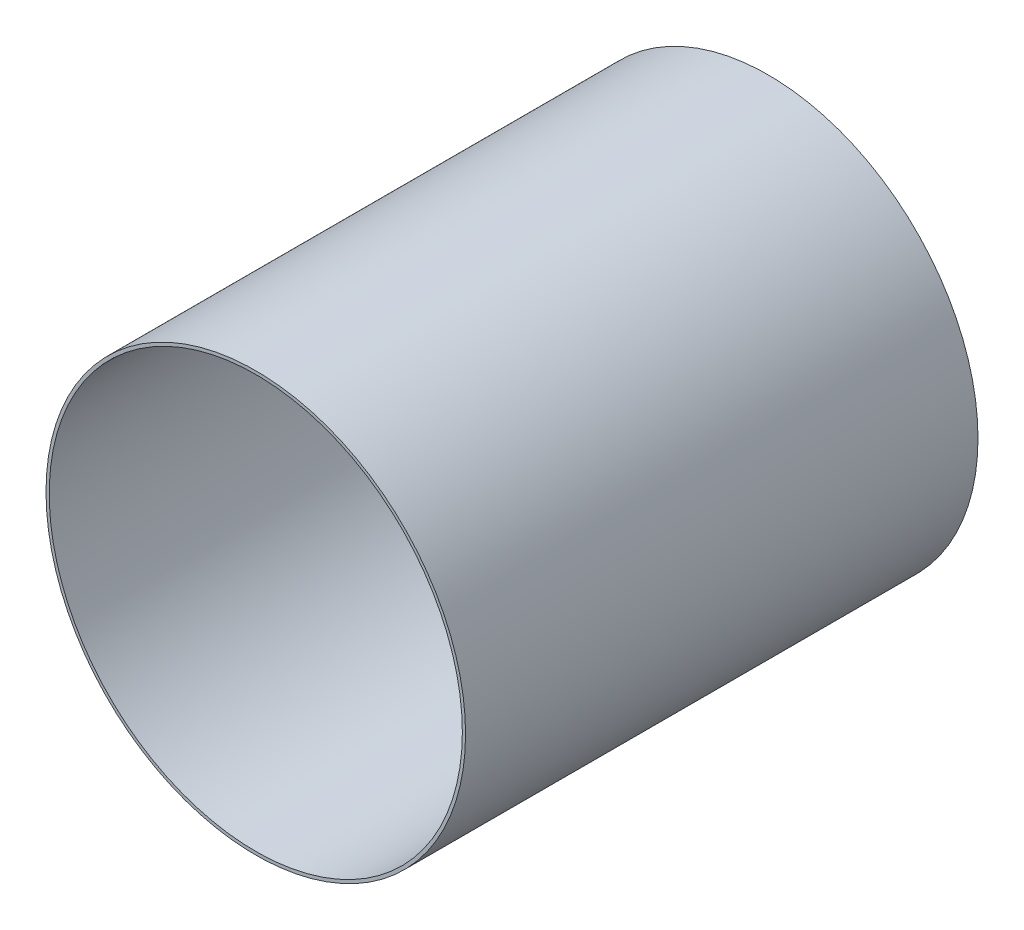
ISO-10303-21;
HEADER;
FILE_DESCRIPTION(('STEP AP214'),'2;1');
FILE_NAME('part.step','',(''),(''),'','','');
FILE_SCHEMA(('AUTOMOTIVE_DESIGN { 1 0 10303 214 1 1 1 1 }'));
ENDSEC;
DATA;
#1=APPLICATION_CONTEXT('core data for automotive mechanical design processes');
#2=APPLICATION_PROTOCOL_DEFINITION('international standard','automotive_design',2000,#1);
#3=PRODUCT_CONTEXT('',#1,'mechanical');
#4=PRODUCT('Part','Part','',(#3));
#5=PRODUCT_RELATED_PRODUCT_CATEGORY('part','',(#4));
#6=PRODUCT_DEFINITION_FORMATION('','',#4);
#7=PRODUCT_DEFINITION_CONTEXT('part definition',#1,'design');
#8=PRODUCT_DEFINITION('design','',#6,#7);
#9=PRODUCT_DEFINITION_SHAPE('','',#8);
#10=(LENGTH_UNIT() NAMED_UNIT(*) SI_UNIT(.MILLI.,.METRE.));
#11=(NAMED_UNIT(*) PLANE_ANGLE_UNIT() SI_UNIT($,.RADIAN.));
#12=(NAMED_UNIT(*) SI_UNIT($,.STERADIAN.) SOLID_ANGLE_UNIT());
#13=UNCERTAINTY_MEASURE_WITH_UNIT(LENGTH_MEASURE(1.E-05),#10,'distance_accuracy_value','');
#14=(GEOMETRIC_REPRESENTATION_CONTEXT(3) GLOBAL_UNCERTAINTY_ASSIGNED_CONTEXT((#13)) GLOBAL_UNIT_ASSIGNED_CONTEXT((#10,
#11,#12)) REPRESENTATION_CONTEXT('',''));
#15=CARTESIAN_POINT('',(0.,0.,0.));
#16=DIRECTION('',(0.,0.,1.));
#17=DIRECTION('',(1.,0.,0.));
#18=AXIS2_PLACEMENT_3D('',#15,#16,#17);
#19=CARTESIAN_POINT('',(0.,0.,31.));
#20=DIRECTION('',(0.,0.,1.));
#21=DIRECTION('',(1.00000000000002,0.,0.));
#22=AXIS2_PLACEMENT_3D('',#19,#20,#21);
#23=PLANE('',#22);
#24=CARTESIAN_POINT('',(0.,0.,31.));
#25=DIRECTION('',(0.,0.,1.));
#26=DIRECTION('',(1.00000000000002,0.,0.));
#27=AXIS2_PLACEMENT_3D('',#24,#25,#26);
#28=CIRCLE('',#27,13.1);
#29=CARTESIAN_POINT('',(13.1000000000003,0.,31.));
#30=VERTEX_POINT('',#29);
#31=EDGE_CURVE('E10',#30,#30,#28,.T.);
#32=ORIENTED_EDGE('',*,*,#31,.T.);
#33=EDGE_LOOP('',(#32));
#34=FACE_BOUND('',#33,.T.);
#35=CARTESIAN_POINT('',(0.,0.,31.));
#36=DIRECTION('',(0.,0.,1.));
#37=DIRECTION('',(1.00000000000002,0.,0.));
#38=AXIS2_PLACEMENT_3D('',#35,#36,#37);
#39=CIRCLE('',#38,12.9);
#40=CARTESIAN_POINT('',(12.9000000000003,0.,31.));
#41=VERTEX_POINT('',#40);
#42=EDGE_CURVE('E37',#41,#41,#39,.T.);
#43=ORIENTED_EDGE('',*,*,#42,.F.);
#44=EDGE_LOOP('',(#43));
#45=FACE_BOUND('',#44,.T.);
#46=ADVANCED_FACE('F30',(#34,#45),#23,.T.);
#47=CARTESIAN_POINT('',(0.,0.,31.));
#48=DIRECTION('',(0.,0.,-1.));
#49=DIRECTION('',(-1.00000000000002,0.,0.));
#50=AXIS2_PLACEMENT_3D('',#47,#48,#49);
#51=CYLINDRICAL_SURFACE('',#50,13.1);
#52=ORIENTED_EDGE('',*,*,#31,.F.);
#53=EDGE_LOOP('',(#52));
#54=FACE_BOUND('',#53,.T.);
#55=CARTESIAN_POINT('',(0.,0.,-1.));
#56=DIRECTION('',(0.,0.,-1.));
#57=DIRECTION('',(-1.00000000000002,0.,0.));
#58=AXIS2_PLACEMENT_3D('',#55,#56,#57);
#59=CIRCLE('',#58,13.1);
#60=CARTESIAN_POINT('',(-13.1000000000003,0.,-1.));
#61=VERTEX_POINT('',#60);
#62=EDGE_CURVE('E46',#61,#61,#59,.T.);
#63=ORIENTED_EDGE('',*,*,#62,.F.);
#64=EDGE_LOOP('',(#63));
#65=FACE_BOUND('',#64,.T.);
#66=ADVANCED_FACE('F32',(#54,#65),#51,.T.);
#67=CARTESIAN_POINT('',(0.,0.,31.));
#68=DIRECTION('',(0.,0.,-1.));
#69=DIRECTION('',(-1.00000000000002,0.,0.));
#70=AXIS2_PLACEMENT_3D('',#67,#68,#69);
#71=CYLINDRICAL_SURFACE('',#70,12.9);
#72=ORIENTED_EDGE('',*,*,#42,.T.);
#73=EDGE_LOOP('',(#72));
#74=FACE_BOUND('',#73,.T.);
#75=CARTESIAN_POINT('',(0.,0.,0.));
#76=DIRECTION('',(0.,0.,1.));
#77=DIRECTION('',(1.00000000000002,0.,0.));
#78=AXIS2_PLACEMENT_3D('',#75,#76,#77);
#79=CIRCLE('',#78,12.9);
#80=CARTESIAN_POINT('',(12.9000000000003,0.,0.));
#81=VERTEX_POINT('',#80);
#82=EDGE_CURVE('E41',#81,#81,#79,.T.);
#83=ORIENTED_EDGE('',*,*,#82,.F.);
#84=EDGE_LOOP('',(#83));
#85=FACE_BOUND('',#84,.T.);
#86=ADVANCED_FACE('F54',(#74,#85),#71,.F.);
#87=CARTESIAN_POINT('',(0.,0.,0.));
#88=DIRECTION('',(0.,0.,-1.));
#89=DIRECTION('',(-1.00000000000002,0.,0.));
#90=AXIS2_PLACEMENT_3D('',#87,#88,#89);
#91=PLANE('',#90);
#92=ORIENTED_EDGE('',*,*,#82,.T.);
#93=EDGE_LOOP('',(#92));
#94=FACE_BOUND('',#93,.T.);
#95=ADVANCED_FACE('F60',(#94),#91,.F.);
#96=CARTESIAN_POINT('',(0.,0.,-1.));
#97=DIRECTION('',(0.,0.,-1.));
#98=DIRECTION('',(-1.00000000000002,0.,0.));
#99=AXIS2_PLACEMENT_3D('',#96,#97,#98);
#100=PLANE('',#99);
#101=ORIENTED_EDGE('',*,*,#62,.T.);
#102=EDGE_LOOP('',(#101));
#103=FACE_BOUND('',#102,.T.);
#104=ADVANCED_FACE('F51',(#103),#100,.T.);
#105=CLOSED_SHELL('',(#46,#66,#86,#95,#104));
#106=MANIFOLD_SOLID_BREP('B2',#105);
#107=ADVANCED_BREP_SHAPE_REPRESENTATION('',(#18,#106),#14);
#108=SHAPE_DEFINITION_REPRESENTATION(#9,#107);
ENDSEC;
END-ISO-10303-21;
